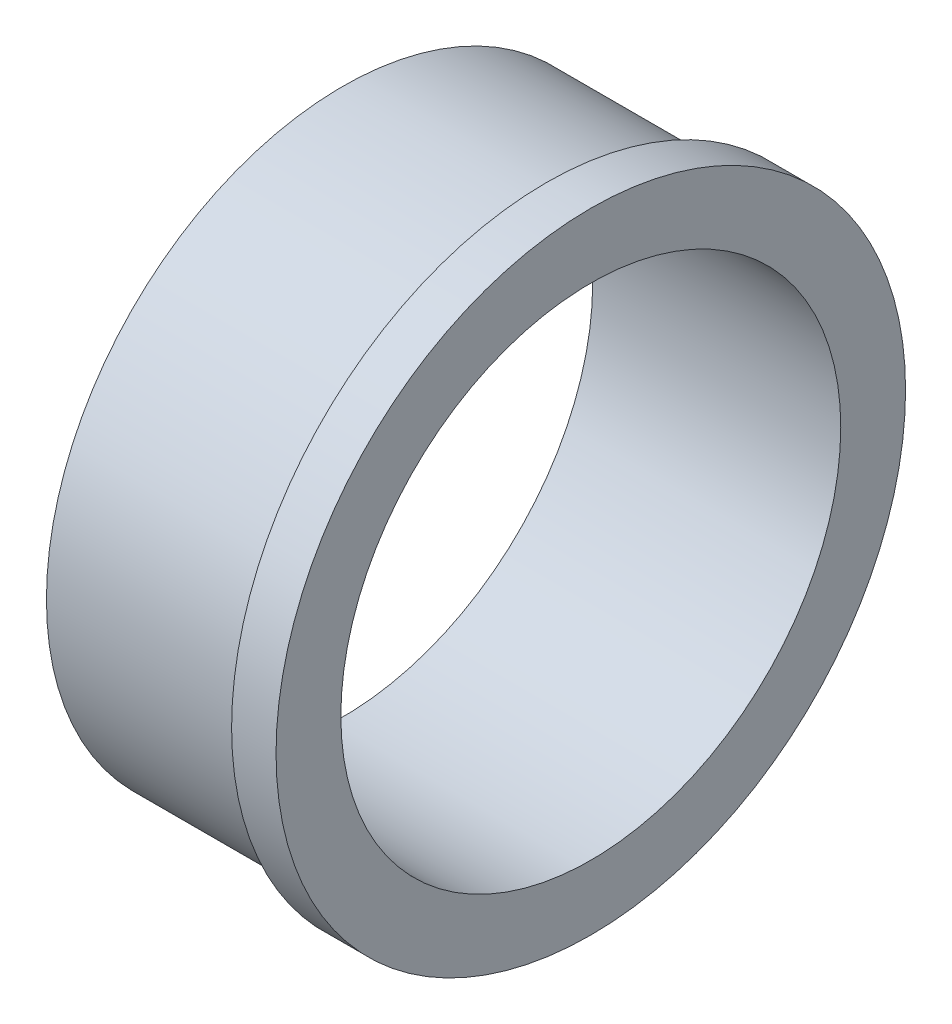
ISO-10303-21;
HEADER;
FILE_DESCRIPTION(('STEP AP214'),'2;1');
FILE_NAME('part.step','',(''),(''),'','','');
FILE_SCHEMA(('AUTOMOTIVE_DESIGN { 1 0 10303 214 1 1 1 1 }'));
ENDSEC;
DATA;
#1=APPLICATION_CONTEXT('core data for automotive mechanical design processes');
#2=APPLICATION_PROTOCOL_DEFINITION('international standard','automotive_design',2000,#1);
#3=PRODUCT_CONTEXT('',#1,'mechanical');
#4=PRODUCT('Part','Part','',(#3));
#5=PRODUCT_RELATED_PRODUCT_CATEGORY('part','',(#4));
#6=PRODUCT_DEFINITION_FORMATION('','',#4);
#7=PRODUCT_DEFINITION_CONTEXT('part definition',#1,'design');
#8=PRODUCT_DEFINITION('design','',#6,#7);
#9=PRODUCT_DEFINITION_SHAPE('','',#8);
#10=(LENGTH_UNIT() NAMED_UNIT(*) SI_UNIT(.MILLI.,.METRE.));
#11=(NAMED_UNIT(*) PLANE_ANGLE_UNIT() SI_UNIT($,.RADIAN.));
#12=(NAMED_UNIT(*) SI_UNIT($,.STERADIAN.) SOLID_ANGLE_UNIT());
#13=UNCERTAINTY_MEASURE_WITH_UNIT(LENGTH_MEASURE(1.E-05),#10,'distance_accuracy_value','');
#14=(GEOMETRIC_REPRESENTATION_CONTEXT(3) GLOBAL_UNCERTAINTY_ASSIGNED_CONTEXT((#13)) GLOBAL_UNIT_ASSIGNED_CONTEXT((#10,
#11,#12)) REPRESENTATION_CONTEXT('',''));
#15=CARTESIAN_POINT('',(0.,0.,0.));
#16=DIRECTION('',(0.,0.,1.));
#17=DIRECTION('',(1.,0.,0.));
#18=AXIS2_PLACEMENT_3D('',#15,#16,#17);
#19=CARTESIAN_POINT('',(0.,12.,0.));
#20=DIRECTION('',(1.,0.,0.));
#21=DIRECTION('',(0.,0.,-1.));
#22=AXIS2_PLACEMENT_3D('',#19,#20,#21);
#23=PLANE('',#22);
#24=CARTESIAN_POINT('',(0.,0.,0.));
#25=DIRECTION('',(-1.,0.,0.));
#26=DIRECTION('',(0.,0.,1.));
#27=AXIS2_PLACEMENT_3D('',#24,#25,#26);
#28=CIRCLE('',#27,10.125);
#29=CARTESIAN_POINT('',(0.,0.,10.125));
#30=VERTEX_POINT('',#29);
#31=EDGE_CURVE('E10',#30,#30,#28,.T.);
#32=ORIENTED_EDGE('',*,*,#31,.F.);
#33=EDGE_LOOP('',(#32));
#34=FACE_BOUND('',#33,.T.);
#35=CARTESIAN_POINT('',(0.,0.,0.));
#36=DIRECTION('',(-1.,0.,0.));
#37=DIRECTION('',(0.,0.,1.));
#38=AXIS2_PLACEMENT_3D('',#35,#36,#37);
#39=CIRCLE('',#38,12.);
#40=CARTESIAN_POINT('',(0.,0.,12.));
#41=VERTEX_POINT('',#40);
#42=EDGE_CURVE('E52',#41,#41,#39,.T.);
#43=ORIENTED_EDGE('',*,*,#42,.T.);
#44=EDGE_LOOP('',(#43));
#45=FACE_BOUND('',#44,.T.);
#46=ADVANCED_FACE('F30',(#34,#45),#23,.F.);
#47=CARTESIAN_POINT('',(0.,0.,0.));
#48=DIRECTION('',(-1.,0.,0.));
#49=DIRECTION('',(0.,0.,1.));
#50=AXIS2_PLACEMENT_3D('',#47,#48,#49);
#51=CYLINDRICAL_SURFACE('',#50,10.125);
#52=CARTESIAN_POINT('',(10.05,0.,0.));
#53=DIRECTION('',(-1.,0.,0.));
#54=DIRECTION('',(0.,0.,1.));
#55=AXIS2_PLACEMENT_3D('',#52,#53,#54);
#56=CIRCLE('',#55,10.125);
#57=CARTESIAN_POINT('',(10.05,0.,10.125));
#58=VERTEX_POINT('',#57);
#59=EDGE_CURVE('E36',#58,#58,#56,.T.);
#60=ORIENTED_EDGE('',*,*,#59,.F.);
#61=EDGE_LOOP('',(#60));
#62=FACE_BOUND('',#61,.T.);
#63=ORIENTED_EDGE('',*,*,#31,.T.);
#64=EDGE_LOOP('',(#63));
#65=FACE_BOUND('',#64,.T.);
#66=ADVANCED_FACE('F77',(#62,#65),#51,.F.);
#67=CARTESIAN_POINT('',(10.05,10.125,0.));
#68=DIRECTION('',(-1.,0.,0.));
#69=DIRECTION('',(0.,0.,1.));
#70=AXIS2_PLACEMENT_3D('',#67,#68,#69);
#71=PLANE('',#70);
#72=CARTESIAN_POINT('',(10.05,0.,0.));
#73=DIRECTION('',(-1.,0.,0.));
#74=DIRECTION('',(0.,0.,1.));
#75=AXIS2_PLACEMENT_3D('',#72,#73,#74);
#76=CIRCLE('',#75,12.75);
#77=CARTESIAN_POINT('',(10.05,0.,12.75));
#78=VERTEX_POINT('',#77);
#79=EDGE_CURVE('E40',#78,#78,#76,.T.);
#80=ORIENTED_EDGE('',*,*,#79,.F.);
#81=EDGE_LOOP('',(#80));
#82=FACE_BOUND('',#81,.T.);
#83=ORIENTED_EDGE('',*,*,#59,.T.);
#84=EDGE_LOOP('',(#83));
#85=FACE_BOUND('',#84,.T.);
#86=ADVANCED_FACE('F72',(#82,#85),#71,.F.);
#87=CARTESIAN_POINT('',(0.,0.,0.));
#88=DIRECTION('',(-1.,0.,0.));
#89=DIRECTION('',(0.,0.,1.));
#90=AXIS2_PLACEMENT_3D('',#87,#88,#89);
#91=CYLINDRICAL_SURFACE('',#90,12.75);
#92=CARTESIAN_POINT('',(8.25,0.,0.));
#93=DIRECTION('',(-1.,0.,0.));
#94=DIRECTION('',(0.,0.,1.));
#95=AXIS2_PLACEMENT_3D('',#92,#93,#94);
#96=CIRCLE('',#95,12.75);
#97=CARTESIAN_POINT('',(8.25,0.,12.75));
#98=VERTEX_POINT('',#97);
#99=EDGE_CURVE('E44',#98,#98,#96,.T.);
#100=ORIENTED_EDGE('',*,*,#99,.F.);
#101=EDGE_LOOP('',(#100));
#102=FACE_BOUND('',#101,.T.);
#103=ORIENTED_EDGE('',*,*,#79,.T.);
#104=EDGE_LOOP('',(#103));
#105=FACE_BOUND('',#104,.T.);
#106=ADVANCED_FACE('F66',(#102,#105),#91,.T.);
#107=CARTESIAN_POINT('',(8.25,12.75,0.));
#108=DIRECTION('',(1.,0.,0.));
#109=DIRECTION('',(0.,0.,-1.));
#110=AXIS2_PLACEMENT_3D('',#107,#108,#109);
#111=PLANE('',#110);
#112=CARTESIAN_POINT('',(8.25,0.,0.));
#113=DIRECTION('',(-1.,0.,0.));
#114=DIRECTION('',(0.,0.,1.));
#115=AXIS2_PLACEMENT_3D('',#112,#113,#114);
#116=CIRCLE('',#115,12.);
#117=CARTESIAN_POINT('',(8.25,0.,12.));
#118=VERTEX_POINT('',#117);
#119=EDGE_CURVE('E49',#118,#118,#116,.T.);
#120=ORIENTED_EDGE('',*,*,#119,.F.);
#121=EDGE_LOOP('',(#120));
#122=FACE_BOUND('',#121,.T.);
#123=ORIENTED_EDGE('',*,*,#99,.T.);
#124=EDGE_LOOP('',(#123));
#125=FACE_BOUND('',#124,.T.);
#126=ADVANCED_FACE('F60',(#122,#125),#111,.F.);
#127=CARTESIAN_POINT('',(0.,0.,0.));
#128=DIRECTION('',(-1.,0.,0.));
#129=DIRECTION('',(0.,0.,1.));
#130=AXIS2_PLACEMENT_3D('',#127,#128,#129);
#131=CYLINDRICAL_SURFACE('',#130,12.);
#132=ORIENTED_EDGE('',*,*,#42,.F.);
#133=EDGE_LOOP('',(#132));
#134=FACE_BOUND('',#133,.T.);
#135=ORIENTED_EDGE('',*,*,#119,.T.);
#136=EDGE_LOOP('',(#135));
#137=FACE_BOUND('',#136,.T.);
#138=ADVANCED_FACE('F57',(#134,#137),#131,.T.);
#139=CLOSED_SHELL('',(#46,#66,#86,#106,#126,#138));
#140=MANIFOLD_SOLID_BREP('B2',#139);
#141=ADVANCED_BREP_SHAPE_REPRESENTATION('',(#18,#140),#14);
#142=SHAPE_DEFINITION_REPRESENTATION(#9,#141);
ENDSEC;
END-ISO-10303-21;
